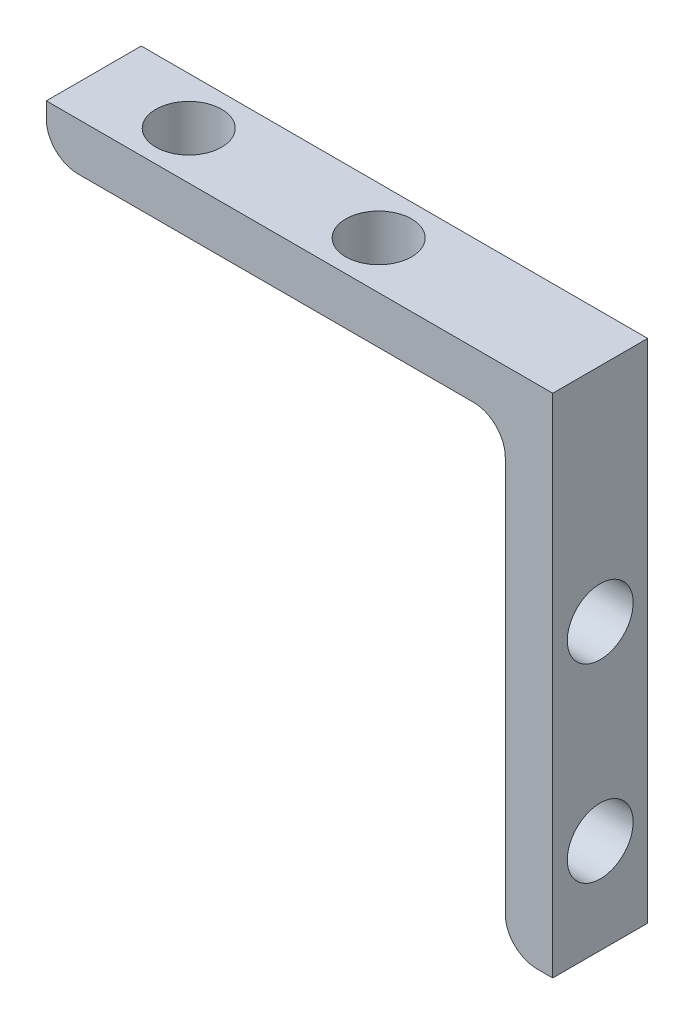
ISO-10303-21;
HEADER;
FILE_DESCRIPTION(('STEP AP214'),'2;1');
FILE_NAME('part.step','',(''),(''),'','','');
FILE_SCHEMA(('AUTOMOTIVE_DESIGN { 1 0 10303 214 1 1 1 1 }'));
ENDSEC;
DATA;
#1=APPLICATION_CONTEXT('core data for automotive mechanical design processes');
#2=APPLICATION_PROTOCOL_DEFINITION('international standard','automotive_design',2000,#1);
#3=PRODUCT_CONTEXT('',#1,'mechanical');
#4=PRODUCT('Part','Part','',(#3));
#5=PRODUCT_RELATED_PRODUCT_CATEGORY('part','',(#4));
#6=PRODUCT_DEFINITION_FORMATION('','',#4);
#7=PRODUCT_DEFINITION_CONTEXT('part definition',#1,'design');
#8=PRODUCT_DEFINITION('design','',#6,#7);
#9=PRODUCT_DEFINITION_SHAPE('','',#8);
#10=(LENGTH_UNIT() NAMED_UNIT(*) SI_UNIT(.MILLI.,.METRE.));
#11=(NAMED_UNIT(*) PLANE_ANGLE_UNIT() SI_UNIT($,.RADIAN.));
#12=(NAMED_UNIT(*) SI_UNIT($,.STERADIAN.) SOLID_ANGLE_UNIT());
#13=UNCERTAINTY_MEASURE_WITH_UNIT(LENGTH_MEASURE(1.E-05),#10,'distance_accuracy_value','');
#14=(GEOMETRIC_REPRESENTATION_CONTEXT(3) GLOBAL_UNCERTAINTY_ASSIGNED_CONTEXT((#13)) GLOBAL_UNIT_ASSIGNED_CONTEXT((#10,
#11,#12)) REPRESENTATION_CONTEXT('',''));
#15=CARTESIAN_POINT('',(0.,0.,0.));
#16=DIRECTION('',(0.,0.,1.));
#17=DIRECTION('',(1.,0.,0.));
#18=AXIS2_PLACEMENT_3D('',#15,#16,#17);
#19=CARTESIAN_POINT('',(-50.8,-4.7625,9.525));
#20=DIRECTION('',(1.,0.,0.));
#21=DIRECTION('',(0.,0.,-1.));
#22=AXIS2_PLACEMENT_3D('',#19,#20,#21);
#23=PLANE('',#22);
#24=DIRECTION('',(0.,-1.,0.));
#25=VECTOR('',#24,1.);
#26=CARTESIAN_POINT('',(-50.8,-4.7625,0.));
#27=LINE('',#26,#25);
#28=CARTESIAN_POINT('',(-50.8,0.,0.));
#29=VERTEX_POINT('',#28);
#30=CARTESIAN_POINT('',(-50.8,-1.5875,0.));
#31=VERTEX_POINT('',#30);
#32=EDGE_CURVE('E137',#29,#31,#27,.T.);
#33=ORIENTED_EDGE('',*,*,#32,.T.);
#34=DIRECTION('',(0.,0.,-1.));
#35=VECTOR('',#34,1.);
#36=CARTESIAN_POINT('',(-50.8,-1.5875,9.525));
#37=LINE('',#36,#35);
#38=CARTESIAN_POINT('',(-50.8,-1.5875,9.525));
#39=VERTEX_POINT('',#38);
#40=EDGE_CURVE('E171',#31,#39,#37,.F.);
#41=ORIENTED_EDGE('',*,*,#40,.T.);
#42=DIRECTION('',(0.,-1.,0.));
#43=VECTOR('',#42,1.);
#44=CARTESIAN_POINT('',(-50.8,-4.7625,9.525));
#45=LINE('',#44,#43);
#46=CARTESIAN_POINT('',(-50.8,0.,9.525));
#47=VERTEX_POINT('',#46);
#48=EDGE_CURVE('E151',#47,#39,#45,.T.);
#49=ORIENTED_EDGE('',*,*,#48,.F.);
#50=DIRECTION('',(0.,0.,-1.));
#51=VECTOR('',#50,1.);
#52=CARTESIAN_POINT('',(-50.8,0.,9.525));
#53=LINE('',#52,#51);
#54=EDGE_CURVE('E133',#47,#29,#53,.T.);
#55=ORIENTED_EDGE('',*,*,#54,.T.);
#56=EDGE_LOOP('',(#33,#41,#49,#55));
#57=FACE_BOUND('',#56,.T.);
#58=ADVANCED_FACE('F34',(#57),#23,.F.);
#59=CARTESIAN_POINT('',(-4.76249999999999,-4.76249999999999,9.525));
#60=DIRECTION('',(0.,1.,0.));
#61=DIRECTION('',(-1.,0.,0.));
#62=AXIS2_PLACEMENT_3D('',#59,#60,#61);
#63=PLANE('',#62);
#64=CARTESIAN_POINT('',(-41.275,-4.7625,4.7625));
#65=DIRECTION('',(0.,-1.,0.));
#66=DIRECTION('',(1.,0.,0.));
#67=AXIS2_PLACEMENT_3D('',#64,#65,#66);
#68=CIRCLE('',#67,3.302);
#69=CARTESIAN_POINT('',(-37.973,-4.7625,4.7625));
#70=VERTEX_POINT('',#69);
#71=EDGE_CURVE('E207',#70,#70,#68,.T.);
#72=ORIENTED_EDGE('',*,*,#71,.F.);
#73=EDGE_LOOP('',(#72));
#74=FACE_BOUND('',#73,.T.);
#75=CARTESIAN_POINT('',(-22.225,-4.76249999999999,4.7625));
#76=DIRECTION('',(0.,-1.,0.));
#77=DIRECTION('',(1.,0.,0.));
#78=AXIS2_PLACEMENT_3D('',#75,#76,#77);
#79=CIRCLE('',#78,3.302);
#80=CARTESIAN_POINT('',(-18.923,-4.76249999999999,4.7625));
#81=VERTEX_POINT('',#80);
#82=EDGE_CURVE('E201',#81,#81,#79,.T.);
#83=ORIENTED_EDGE('',*,*,#82,.F.);
#84=EDGE_LOOP('',(#83));
#85=FACE_BOUND('',#84,.T.);
#86=DIRECTION('',(1.,0.,0.));
#87=VECTOR('',#86,1.);
#88=CARTESIAN_POINT('',(-4.76249999999999,-4.76249999999999,9.525));
#89=LINE('',#88,#87);
#90=CARTESIAN_POINT('',(-47.625,-4.7625,9.525));
#91=VERTEX_POINT('',#90);
#92=CARTESIAN_POINT('',(-7.93749999999999,-4.76249999999999,9.525));
#93=VERTEX_POINT('',#92);
#94=EDGE_CURVE('E182',#91,#93,#89,.T.);
#95=ORIENTED_EDGE('',*,*,#94,.F.);
#96=DIRECTION('',(0.,0.,-1.));
#97=VECTOR('',#96,1.);
#98=CARTESIAN_POINT('',(-47.625,-4.7625,9.525));
#99=LINE('',#98,#97);
#100=CARTESIAN_POINT('',(-47.625,-4.7625,0.));
#101=VERTEX_POINT('',#100);
#102=EDGE_CURVE('E168',#91,#101,#99,.T.);
#103=ORIENTED_EDGE('',*,*,#102,.T.);
#104=DIRECTION('',(1.,0.,0.));
#105=VECTOR('',#104,1.);
#106=CARTESIAN_POINT('',(-4.76249999999999,-4.76249999999999,0.));
#107=LINE('',#106,#105);
#108=CARTESIAN_POINT('',(-7.93749999999999,-4.76249999999999,0.));
#109=VERTEX_POINT('',#108);
#110=EDGE_CURVE('E140',#101,#109,#107,.T.);
#111=ORIENTED_EDGE('',*,*,#110,.T.);
#112=DIRECTION('',(0.,0.,-1.));
#113=VECTOR('',#112,1.);
#114=CARTESIAN_POINT('',(-7.93749999999999,-4.76249999999999,9.525));
#115=LINE('',#114,#113);
#116=EDGE_CURVE('E49',#109,#93,#115,.F.);
#117=ORIENTED_EDGE('',*,*,#116,.T.);
#118=EDGE_LOOP('',(#95,#103,#111,#117));
#119=FACE_BOUND('',#118,.T.);
#120=ADVANCED_FACE('F178',(#74,#85,#119),#63,.F.);
#121=CARTESIAN_POINT('',(-4.76249999999999,-50.8,9.525));
#122=DIRECTION('',(1.,0.,0.));
#123=DIRECTION('',(0.,1.,0.));
#124=AXIS2_PLACEMENT_3D('',#121,#122,#123);
#125=PLANE('',#124);
#126=CARTESIAN_POINT('',(-4.76249999999999,-22.225,4.7625));
#127=DIRECTION('',(-1.,0.,0.));
#128=DIRECTION('',(0.,-1.,0.));
#129=AXIS2_PLACEMENT_3D('',#126,#127,#128);
#130=CIRCLE('',#129,3.302);
#131=CARTESIAN_POINT('',(-4.76249999999999,-25.527,4.7625));
#132=VERTEX_POINT('',#131);
#133=EDGE_CURVE('E196',#132,#132,#130,.T.);
#134=ORIENTED_EDGE('',*,*,#133,.F.);
#135=EDGE_LOOP('',(#134));
#136=FACE_BOUND('',#135,.T.);
#137=CARTESIAN_POINT('',(-4.76249999999999,-41.275,4.7625));
#138=DIRECTION('',(-1.,0.,0.));
#139=DIRECTION('',(0.,-1.,0.));
#140=AXIS2_PLACEMENT_3D('',#137,#138,#139);
#141=CIRCLE('',#140,3.302);
#142=CARTESIAN_POINT('',(-4.76249999999999,-44.577,4.7625));
#143=VERTEX_POINT('',#142);
#144=EDGE_CURVE('E189',#143,#143,#141,.T.);
#145=ORIENTED_EDGE('',*,*,#144,.F.);
#146=EDGE_LOOP('',(#145));
#147=FACE_BOUND('',#146,.T.);
#148=DIRECTION('',(0.,-1.,0.));
#149=VECTOR('',#148,1.);
#150=CARTESIAN_POINT('',(-4.76249999999999,-50.8,0.));
#151=LINE('',#150,#149);
#152=CARTESIAN_POINT('',(-4.76249999999999,-7.9375,0.));
#153=VERTEX_POINT('',#152);
#154=CARTESIAN_POINT('',(-4.76249999999999,-47.625,0.));
#155=VERTEX_POINT('',#154);
#156=EDGE_CURVE('E143',#153,#155,#151,.T.);
#157=ORIENTED_EDGE('',*,*,#156,.T.);
#158=DIRECTION('',(0.,0.,-1.));
#159=VECTOR('',#158,1.);
#160=CARTESIAN_POINT('',(-4.76249999999999,-47.625,9.525));
#161=LINE('',#160,#159);
#162=CARTESIAN_POINT('',(-4.76249999999999,-47.625,9.525));
#163=VERTEX_POINT('',#162);
#164=EDGE_CURVE('E163',#155,#163,#161,.F.);
#165=ORIENTED_EDGE('',*,*,#164,.T.);
#166=DIRECTION('',(0.,-1.,0.));
#167=VECTOR('',#166,1.);
#168=CARTESIAN_POINT('',(-4.76249999999999,-50.8,9.525));
#169=LINE('',#168,#167);
#170=CARTESIAN_POINT('',(-4.76249999999999,-7.9375,9.525));
#171=VERTEX_POINT('',#170);
#172=EDGE_CURVE('E116',#171,#163,#169,.T.);
#173=ORIENTED_EDGE('',*,*,#172,.F.);
#174=DIRECTION('',(0.,0.,-1.));
#175=VECTOR('',#174,1.);
#176=CARTESIAN_POINT('',(-4.76249999999999,-7.93749999999999,0.));
#177=LINE('',#176,#175);
#178=EDGE_CURVE('E160',#171,#153,#177,.T.);
#179=ORIENTED_EDGE('',*,*,#178,.T.);
#180=EDGE_LOOP('',(#157,#165,#173,#179));
#181=FACE_BOUND('',#180,.T.);
#182=ADVANCED_FACE('F184',(#136,#147,#181),#125,.F.);
#183=CARTESIAN_POINT('',(0.,-50.8,9.525));
#184=DIRECTION('',(0.,1.,0.));
#185=DIRECTION('',(0.,0.,1.));
#186=AXIS2_PLACEMENT_3D('',#183,#184,#185);
#187=PLANE('',#186);
#188=DIRECTION('',(1.,0.,0.));
#189=VECTOR('',#188,1.);
#190=CARTESIAN_POINT('',(0.,-50.8,9.525));
#191=LINE('',#190,#189);
#192=CARTESIAN_POINT('',(-1.58749999999999,-50.8,9.525));
#193=VERTEX_POINT('',#192);
#194=CARTESIAN_POINT('',(0.,-50.8,9.525));
#195=VERTEX_POINT('',#194);
#196=EDGE_CURVE('E104',#193,#195,#191,.T.);
#197=ORIENTED_EDGE('',*,*,#196,.F.);
#198=DIRECTION('',(0.,0.,-1.));
#199=VECTOR('',#198,1.);
#200=CARTESIAN_POINT('',(-1.58749999999999,-50.8,9.525));
#201=LINE('',#200,#199);
#202=CARTESIAN_POINT('',(-1.58749999999999,-50.8,0.));
#203=VERTEX_POINT('',#202);
#204=EDGE_CURVE('E125',#193,#203,#201,.T.);
#205=ORIENTED_EDGE('',*,*,#204,.T.);
#206=DIRECTION('',(1.,0.,0.));
#207=VECTOR('',#206,1.);
#208=CARTESIAN_POINT('',(0.,-50.8,0.));
#209=LINE('',#208,#207);
#210=CARTESIAN_POINT('',(0.,-50.8,0.));
#211=VERTEX_POINT('',#210);
#212=EDGE_CURVE('E122',#203,#211,#209,.T.);
#213=ORIENTED_EDGE('',*,*,#212,.T.);
#214=DIRECTION('',(0.,0.,-1.));
#215=VECTOR('',#214,1.);
#216=CARTESIAN_POINT('',(0.,-50.8,9.525));
#217=LINE('',#216,#215);
#218=EDGE_CURVE('E119',#195,#211,#217,.T.);
#219=ORIENTED_EDGE('',*,*,#218,.F.);
#220=EDGE_LOOP('',(#197,#205,#213,#219));
#221=FACE_BOUND('',#220,.T.);
#222=ADVANCED_FACE('F120',(#221),#187,.F.);
#223=CARTESIAN_POINT('',(0.,0.,9.525));
#224=DIRECTION('',(-1.,0.,0.));
#225=DIRECTION('',(0.,-1.,0.));
#226=AXIS2_PLACEMENT_3D('',#223,#224,#225);
#227=PLANE('',#226);
#228=CARTESIAN_POINT('',(0.,-22.225,4.7625));
#229=DIRECTION('',(-1.,0.,0.));
#230=DIRECTION('',(0.,-1.,0.));
#231=AXIS2_PLACEMENT_3D('',#228,#229,#230);
#232=CIRCLE('',#231,3.302);
#233=CARTESIAN_POINT('',(0.,-25.527,4.7625));
#234=VERTEX_POINT('',#233);
#235=EDGE_CURVE('E141',#234,#234,#232,.T.);
#236=ORIENTED_EDGE('',*,*,#235,.T.);
#237=EDGE_LOOP('',(#236));
#238=FACE_BOUND('',#237,.T.);
#239=CARTESIAN_POINT('',(0.,-41.275,4.7625));
#240=DIRECTION('',(-1.,0.,0.));
#241=DIRECTION('',(0.,-1.,0.));
#242=AXIS2_PLACEMENT_3D('',#239,#240,#241);
#243=CIRCLE('',#242,3.302);
#244=CARTESIAN_POINT('',(0.,-44.577,4.7625));
#245=VERTEX_POINT('',#244);
#246=EDGE_CURVE('E192',#245,#245,#243,.T.);
#247=ORIENTED_EDGE('',*,*,#246,.T.);
#248=EDGE_LOOP('',(#247));
#249=FACE_BOUND('',#248,.T.);
#250=DIRECTION('',(0.,1.,0.));
#251=VECTOR('',#250,1.);
#252=CARTESIAN_POINT('',(0.,0.,0.));
#253=LINE('',#252,#251);
#254=CARTESIAN_POINT('',(0.,0.,0.));
#255=VERTEX_POINT('',#254);
#256=EDGE_CURVE('E147',#211,#255,#253,.T.);
#257=ORIENTED_EDGE('',*,*,#256,.T.);
#258=DIRECTION('',(0.,0.,-1.));
#259=VECTOR('',#258,1.);
#260=CARTESIAN_POINT('',(0.,0.,9.525));
#261=LINE('',#260,#259);
#262=CARTESIAN_POINT('',(0.,0.,9.525));
#263=VERTEX_POINT('',#262);
#264=EDGE_CURVE('E126',#263,#255,#261,.T.);
#265=ORIENTED_EDGE('',*,*,#264,.F.);
#266=DIRECTION('',(0.,1.,0.));
#267=VECTOR('',#266,1.);
#268=CARTESIAN_POINT('',(0.,0.,9.525));
#269=LINE('',#268,#267);
#270=EDGE_CURVE('E109',#195,#263,#269,.T.);
#271=ORIENTED_EDGE('',*,*,#270,.F.);
#272=ORIENTED_EDGE('',*,*,#218,.T.);
#273=EDGE_LOOP('',(#257,#265,#271,#272));
#274=FACE_BOUND('',#273,.T.);
#275=ADVANCED_FACE('F128',(#238,#249,#274),#227,.F.);
#276=CARTESIAN_POINT('',(-50.8,0.,9.525));
#277=DIRECTION('',(0.,-1.,0.));
#278=DIRECTION('',(0.,0.,-1.));
#279=AXIS2_PLACEMENT_3D('',#276,#277,#278);
#280=PLANE('',#279);
#281=CARTESIAN_POINT('',(-41.275,0.,4.7625));
#282=DIRECTION('',(0.,-1.,0.));
#283=DIRECTION('',(1.,0.,0.));
#284=AXIS2_PLACEMENT_3D('',#281,#282,#283);
#285=CIRCLE('',#284,3.302);
#286=CARTESIAN_POINT('',(-37.973,0.,4.7625));
#287=VERTEX_POINT('',#286);
#288=EDGE_CURVE('E193',#287,#287,#285,.T.);
#289=ORIENTED_EDGE('',*,*,#288,.T.);
#290=EDGE_LOOP('',(#289));
#291=FACE_BOUND('',#290,.T.);
#292=CARTESIAN_POINT('',(-22.225,0.,4.7625));
#293=DIRECTION('',(0.,-1.,0.));
#294=DIRECTION('',(1.,0.,0.));
#295=AXIS2_PLACEMENT_3D('',#292,#293,#294);
#296=CIRCLE('',#295,3.302);
#297=CARTESIAN_POINT('',(-18.923,0.,4.7625));
#298=VERTEX_POINT('',#297);
#299=EDGE_CURVE('E204',#298,#298,#296,.T.);
#300=ORIENTED_EDGE('',*,*,#299,.T.);
#301=EDGE_LOOP('',(#300));
#302=FACE_BOUND('',#301,.T.);
#303=DIRECTION('',(-1.,0.,0.));
#304=VECTOR('',#303,1.);
#305=CARTESIAN_POINT('',(-50.8,0.,0.));
#306=LINE('',#305,#304);
#307=EDGE_CURVE('E149',#255,#29,#306,.T.);
#308=ORIENTED_EDGE('',*,*,#307,.T.);
#309=ORIENTED_EDGE('',*,*,#54,.F.);
#310=DIRECTION('',(-1.,0.,0.));
#311=VECTOR('',#310,1.);
#312=CARTESIAN_POINT('',(-50.8,0.,9.525));
#313=LINE('',#312,#311);
#314=EDGE_CURVE('E131',#263,#47,#313,.T.);
#315=ORIENTED_EDGE('',*,*,#314,.F.);
#316=ORIENTED_EDGE('',*,*,#264,.T.);
#317=EDGE_LOOP('',(#308,#309,#315,#316));
#318=FACE_BOUND('',#317,.T.);
#319=ADVANCED_FACE('F213',(#291,#302,#318),#280,.F.);
#320=CARTESIAN_POINT('',(0.,0.,9.525));
#321=DIRECTION('',(0.,0.,-1.));
#322=DIRECTION('',(-1.,0.,0.));
#323=AXIS2_PLACEMENT_3D('',#320,#321,#322);
#324=PLANE('',#323);
#325=ORIENTED_EDGE('',*,*,#172,.T.);
#326=CARTESIAN_POINT('',(-1.58749999999999,-47.625,9.525));
#327=DIRECTION('',(0.,0.,-1.));
#328=DIRECTION('',(-1.,0.,0.));
#329=AXIS2_PLACEMENT_3D('',#326,#327,#328);
#330=CIRCLE('',#329,3.175);
#331=EDGE_CURVE('E112',#163,#193,#330,.F.);
#332=ORIENTED_EDGE('',*,*,#331,.T.);
#333=ORIENTED_EDGE('',*,*,#196,.T.);
#334=ORIENTED_EDGE('',*,*,#270,.T.);
#335=ORIENTED_EDGE('',*,*,#314,.T.);
#336=ORIENTED_EDGE('',*,*,#48,.T.);
#337=CARTESIAN_POINT('',(-47.625,-1.5875,9.525));
#338=DIRECTION('',(0.,0.,-1.));
#339=DIRECTION('',(-1.,0.,0.));
#340=AXIS2_PLACEMENT_3D('',#337,#338,#339);
#341=CIRCLE('',#340,3.175);
#342=EDGE_CURVE('E56',#39,#91,#341,.F.);
#343=ORIENTED_EDGE('',*,*,#342,.T.);
#344=ORIENTED_EDGE('',*,*,#94,.T.);
#345=CARTESIAN_POINT('',(-7.93749999999999,-7.93749999999999,9.525));
#346=DIRECTION('',(0.,0.,-1.));
#347=DIRECTION('',(-1.,0.,0.));
#348=AXIS2_PLACEMENT_3D('',#345,#346,#347);
#349=CIRCLE('',#348,3.175);
#350=EDGE_CURVE('E12',#93,#171,#349,.T.);
#351=ORIENTED_EDGE('',*,*,#350,.T.);
#352=EDGE_LOOP('',(#325,#332,#333,#334,#335,#336,#343,#344,#351));
#353=FACE_BOUND('',#352,.T.);
#354=ADVANCED_FACE('F107',(#353),#324,.F.);
#355=CARTESIAN_POINT('',(0.,0.,0.));
#356=DIRECTION('',(0.,0.,-1.));
#357=DIRECTION('',(-1.,0.,0.));
#358=AXIS2_PLACEMENT_3D('',#355,#356,#357);
#359=PLANE('',#358);
#360=ORIENTED_EDGE('',*,*,#212,.F.);
#361=CARTESIAN_POINT('',(-1.58749999999999,-47.625,0.));
#362=DIRECTION('',(0.,0.,-1.));
#363=DIRECTION('',(-1.,0.,0.));
#364=AXIS2_PLACEMENT_3D('',#361,#362,#363);
#365=CIRCLE('',#364,3.175);
#366=EDGE_CURVE('E158',#203,#155,#365,.T.);
#367=ORIENTED_EDGE('',*,*,#366,.T.);
#368=ORIENTED_EDGE('',*,*,#156,.F.);
#369=CARTESIAN_POINT('',(-7.93749999999999,-7.93749999999999,0.));
#370=DIRECTION('',(0.,0.,-1.));
#371=DIRECTION('',(-1.,0.,0.));
#372=AXIS2_PLACEMENT_3D('',#369,#370,#371);
#373=CIRCLE('',#372,3.175);
#374=EDGE_CURVE('E42',#153,#109,#373,.F.);
#375=ORIENTED_EDGE('',*,*,#374,.T.);
#376=ORIENTED_EDGE('',*,*,#110,.F.);
#377=CARTESIAN_POINT('',(-47.625,-1.5875,0.));
#378=DIRECTION('',(0.,0.,-1.));
#379=DIRECTION('',(-1.,0.,0.));
#380=AXIS2_PLACEMENT_3D('',#377,#378,#379);
#381=CIRCLE('',#380,3.175);
#382=EDGE_CURVE('E156',#101,#31,#381,.T.);
#383=ORIENTED_EDGE('',*,*,#382,.T.);
#384=ORIENTED_EDGE('',*,*,#32,.F.);
#385=ORIENTED_EDGE('',*,*,#307,.F.);
#386=ORIENTED_EDGE('',*,*,#256,.F.);
#387=EDGE_LOOP('',(#360,#367,#368,#375,#376,#383,#384,#385,#386));
#388=FACE_BOUND('',#387,.T.);
#389=ADVANCED_FACE('F175',(#388),#359,.T.);
#390=CARTESIAN_POINT('',(-1.58749999999999,-47.625,9.525));
#391=DIRECTION('',(0.,0.,-1.));
#392=DIRECTION('',(-1.,0.,0.));
#393=AXIS2_PLACEMENT_3D('',#390,#391,#392);
#394=CYLINDRICAL_SURFACE('',#393,3.175);
#395=ORIENTED_EDGE('',*,*,#331,.F.);
#396=ORIENTED_EDGE('',*,*,#164,.F.);
#397=ORIENTED_EDGE('',*,*,#366,.F.);
#398=ORIENTED_EDGE('',*,*,#204,.F.);
#399=EDGE_LOOP('',(#395,#396,#397,#398));
#400=FACE_BOUND('',#399,.T.);
#401=ADVANCED_FACE('F246',(#400),#394,.T.);
#402=CARTESIAN_POINT('',(-47.625,-1.5875,9.525));
#403=DIRECTION('',(0.,0.,-1.));
#404=DIRECTION('',(-1.,0.,0.));
#405=AXIS2_PLACEMENT_3D('',#402,#403,#404);
#406=CYLINDRICAL_SURFACE('',#405,3.175);
#407=ORIENTED_EDGE('',*,*,#342,.F.);
#408=ORIENTED_EDGE('',*,*,#40,.F.);
#409=ORIENTED_EDGE('',*,*,#382,.F.);
#410=ORIENTED_EDGE('',*,*,#102,.F.);
#411=EDGE_LOOP('',(#407,#408,#409,#410));
#412=FACE_BOUND('',#411,.T.);
#413=ADVANCED_FACE('F248',(#412),#406,.T.);
#414=CARTESIAN_POINT('',(-7.93749999999999,-7.93749999999999,9.525));
#415=DIRECTION('',(0.,0.,1.));
#416=DIRECTION('',(1.,0.,0.));
#417=AXIS2_PLACEMENT_3D('',#414,#415,#416);
#418=CYLINDRICAL_SURFACE('',#417,3.175);
#419=ORIENTED_EDGE('',*,*,#350,.F.);
#420=ORIENTED_EDGE('',*,*,#116,.F.);
#421=ORIENTED_EDGE('',*,*,#374,.F.);
#422=ORIENTED_EDGE('',*,*,#178,.F.);
#423=EDGE_LOOP('',(#419,#420,#421,#422));
#424=FACE_BOUND('',#423,.T.);
#425=ADVANCED_FACE('F36',(#424),#418,.F.);
#426=CARTESIAN_POINT('',(0.,-41.275,4.7625));
#427=DIRECTION('',(-1.,0.,0.));
#428=DIRECTION('',(0.,-1.,0.));
#429=AXIS2_PLACEMENT_3D('',#426,#427,#428);
#430=CYLINDRICAL_SURFACE('',#429,3.302);
#431=CARTESIAN_POINT('',(0.,-44.577,4.7625));
#432=CARTESIAN_POINT('',(-0.0496093749999942,-44.577,4.7625));
#433=CARTESIAN_POINT('',(-0.0992187499999942,-44.577,4.7625));
#434=CARTESIAN_POINT('',(-0.198437499999994,-44.577,4.7625));
#435=CARTESIAN_POINT('',(-0.248046874999994,-44.577,4.7625));
#436=CARTESIAN_POINT('',(-0.347265624999994,-44.577,4.7625));
#437=CARTESIAN_POINT('',(-0.396874999999994,-44.577,4.7625));
#438=CARTESIAN_POINT('',(-0.496093749999994,-44.577,4.7625));
#439=CARTESIAN_POINT('',(-0.545703124999994,-44.577,4.7625));
#440=CARTESIAN_POINT('',(-0.644921874999994,-44.577,4.7625));
#441=CARTESIAN_POINT('',(-0.694531249999994,-44.577,4.7625));
#442=CARTESIAN_POINT('',(-0.793749999999994,-44.577,4.7625));
#443=CARTESIAN_POINT('',(-0.843359374999994,-44.577,4.7625));
#444=CARTESIAN_POINT('',(-0.942578124999994,-44.577,4.7625));
#445=CARTESIAN_POINT('',(-0.992187499999994,-44.577,4.7625));
#446=CARTESIAN_POINT('',(-1.09140624999999,-44.577,4.7625));
#447=CARTESIAN_POINT('',(-1.14101562499999,-44.577,4.7625));
#448=CARTESIAN_POINT('',(-1.24023437499999,-44.577,4.7625));
#449=CARTESIAN_POINT('',(-1.28984374999999,-44.577,4.7625));
#450=CARTESIAN_POINT('',(-1.38906249999999,-44.577,4.7625));
#451=CARTESIAN_POINT('',(-1.43867187499999,-44.577,4.7625));
#452=CARTESIAN_POINT('',(-1.53789062499999,-44.577,4.7625));
#453=CARTESIAN_POINT('',(-1.58749999999999,-44.577,4.7625));
#454=CARTESIAN_POINT('',(-1.68671874999999,-44.577,4.7625));
#455=CARTESIAN_POINT('',(-1.73632812499999,-44.577,4.7625));
#456=CARTESIAN_POINT('',(-1.83554687499999,-44.577,4.7625));
#457=CARTESIAN_POINT('',(-1.88515624999999,-44.577,4.7625));
#458=CARTESIAN_POINT('',(-1.98437499999999,-44.577,4.7625));
#459=CARTESIAN_POINT('',(-2.03398437499999,-44.577,4.7625));
#460=CARTESIAN_POINT('',(-2.13320312499999,-44.577,4.7625));
#461=CARTESIAN_POINT('',(-2.18281249999999,-44.577,4.7625));
#462=CARTESIAN_POINT('',(-2.28203124999999,-44.577,4.7625));
#463=CARTESIAN_POINT('',(-2.33164062499999,-44.577,4.7625));
#464=CARTESIAN_POINT('',(-2.43085937499999,-44.577,4.7625));
#465=CARTESIAN_POINT('',(-2.48046874999999,-44.577,4.7625));
#466=CARTESIAN_POINT('',(-2.57968749999999,-44.577,4.7625));
#467=CARTESIAN_POINT('',(-2.62929687499999,-44.577,4.7625));
#468=CARTESIAN_POINT('',(-2.72851562499999,-44.577,4.7625));
#469=CARTESIAN_POINT('',(-2.77812499999999,-44.577,4.7625));
#470=CARTESIAN_POINT('',(-2.87734374999999,-44.577,4.7625));
#471=CARTESIAN_POINT('',(-2.92695312499999,-44.577,4.7625));
#472=CARTESIAN_POINT('',(-3.02617187499999,-44.577,4.7625));
#473=CARTESIAN_POINT('',(-3.07578124999999,-44.577,4.7625));
#474=CARTESIAN_POINT('',(-3.17499999999999,-44.577,4.7625));
#475=CARTESIAN_POINT('',(-3.22460937499999,-44.577,4.7625));
#476=CARTESIAN_POINT('',(-3.32382812499999,-44.577,4.7625));
#477=CARTESIAN_POINT('',(-3.37343749999999,-44.577,4.7625));
#478=CARTESIAN_POINT('',(-3.47265624999999,-44.577,4.7625));
#479=CARTESIAN_POINT('',(-3.52226562499999,-44.577,4.7625));
#480=CARTESIAN_POINT('',(-3.62148437499999,-44.577,4.7625));
#481=CARTESIAN_POINT('',(-3.67109374999999,-44.577,4.7625));
#482=CARTESIAN_POINT('',(-3.77031249999999,-44.577,4.7625));
#483=CARTESIAN_POINT('',(-3.81992187499999,-44.577,4.7625));
#484=CARTESIAN_POINT('',(-3.91914062499999,-44.577,4.7625));
#485=CARTESIAN_POINT('',(-3.96874999999999,-44.577,4.7625));
#486=CARTESIAN_POINT('',(-4.06796874999999,-44.577,4.7625));
#487=CARTESIAN_POINT('',(-4.11757812499999,-44.577,4.7625));
#488=CARTESIAN_POINT('',(-4.21679687499999,-44.577,4.7625));
#489=CARTESIAN_POINT('',(-4.26640624999999,-44.577,4.7625));
#490=CARTESIAN_POINT('',(-4.36562499999999,-44.577,4.7625));
#491=CARTESIAN_POINT('',(-4.41523437499999,-44.577,4.7625));
#492=CARTESIAN_POINT('',(-4.51445312499999,-44.577,4.7625));
#493=CARTESIAN_POINT('',(-4.56406249999999,-44.577,4.7625));
#494=CARTESIAN_POINT('',(-4.66328124999999,-44.577,4.7625));
#495=CARTESIAN_POINT('',(-4.71289062499999,-44.577,4.7625));
#496=CARTESIAN_POINT('',(-4.76249999999999,-44.577,4.7625));
#497=B_SPLINE_CURVE_WITH_KNOTS('',3,(#431,#432,#433,#434,#435,#436,#437,#438,#439,#440,#441,
#442,#443,#444,#445,#446,#447,#448,#449,#450,#451,#452,#453,#454,#455,#456,#457,#458,#459,#460,
#461,#462,#463,#464,#465,#466,#467,#468,#469,#470,#471,#472,#473,#474,#475,#476,#477,#478,#479,
#480,#481,#482,#483,#484,#485,#486,#487,#488,#489,#490,#491,#492,#493,#494,#495,#496),
.UNSPECIFIED.,.F.,.F.,(4,2,2,2,2,2,2,2,2,2,2,2,2,2,2,2,2,2,2,2,2,2,2,2,2,2,2,2,2,2,2,2,4),(0.,
0.148828125,0.29765625,0.446484375,0.5953125,0.744140625,0.89296875,1.041796875,1.190625,
1.339453125,1.48828125,1.637109375,1.7859375,1.934765625,2.08359375,2.232421875,2.38125,
2.530078125,2.67890625,2.827734375,2.9765625,3.125390625,3.27421875,3.423046875,3.571875,
3.720703125,3.86953125,4.018359375,4.1671875,4.316015625,4.46484375,4.613671875,4.7625),.UNSPECIFIED.);
#498=EDGE_CURVE('BSEAM235',#245,#143,#497,.T.);
#499=ORIENTED_EDGE('',*,*,#246,.F.);
#500=ORIENTED_EDGE('',*,*,#144,.T.);
#501=ORIENTED_EDGE('',*,*,#498,.T.);
#502=ORIENTED_EDGE('',*,*,#498,.F.);
#503=EDGE_LOOP('',(#499,#501,#500,#502));
#504=FACE_BOUND('',#503,.T.);
#505=ADVANCED_FACE('F235',(#504),#430,.F.);
#506=CARTESIAN_POINT('',(0.,-22.225,4.7625));
#507=DIRECTION('',(-1.,0.,0.));
#508=DIRECTION('',(0.,-1.,0.));
#509=AXIS2_PLACEMENT_3D('',#506,#507,#508);
#510=CYLINDRICAL_SURFACE('',#509,3.302);
#511=CARTESIAN_POINT('',(0.,-25.527,4.7625));
#512=CARTESIAN_POINT('',(-0.0496093749999924,-25.527,4.7625));
#513=CARTESIAN_POINT('',(-0.0992187499999924,-25.527,4.7625));
#514=CARTESIAN_POINT('',(-0.198437499999992,-25.527,4.7625));
#515=CARTESIAN_POINT('',(-0.248046874999992,-25.527,4.7625));
#516=CARTESIAN_POINT('',(-0.347265624999992,-25.527,4.7625));
#517=CARTESIAN_POINT('',(-0.396874999999992,-25.527,4.7625));
#518=CARTESIAN_POINT('',(-0.496093749999993,-25.527,4.7625));
#519=CARTESIAN_POINT('',(-0.545703124999993,-25.527,4.7625));
#520=CARTESIAN_POINT('',(-0.644921874999993,-25.527,4.7625));
#521=CARTESIAN_POINT('',(-0.694531249999992,-25.527,4.7625));
#522=CARTESIAN_POINT('',(-0.793749999999993,-25.527,4.7625));
#523=CARTESIAN_POINT('',(-0.843359374999993,-25.527,4.7625));
#524=CARTESIAN_POINT('',(-0.942578124999992,-25.527,4.7625));
#525=CARTESIAN_POINT('',(-0.992187499999992,-25.527,4.7625));
#526=CARTESIAN_POINT('',(-1.09140624999999,-25.527,4.7625));
#527=CARTESIAN_POINT('',(-1.14101562499999,-25.527,4.7625));
#528=CARTESIAN_POINT('',(-1.24023437499999,-25.527,4.7625));
#529=CARTESIAN_POINT('',(-1.28984374999999,-25.527,4.7625));
#530=CARTESIAN_POINT('',(-1.38906249999999,-25.527,4.7625));
#531=CARTESIAN_POINT('',(-1.43867187499999,-25.527,4.7625));
#532=CARTESIAN_POINT('',(-1.53789062499999,-25.527,4.7625));
#533=CARTESIAN_POINT('',(-1.58749999999999,-25.527,4.7625));
#534=CARTESIAN_POINT('',(-1.68671874999999,-25.527,4.7625));
#535=CARTESIAN_POINT('',(-1.73632812499999,-25.527,4.7625));
#536=CARTESIAN_POINT('',(-1.83554687499999,-25.527,4.7625));
#537=CARTESIAN_POINT('',(-1.88515624999999,-25.527,4.7625));
#538=CARTESIAN_POINT('',(-1.98437499999999,-25.527,4.7625));
#539=CARTESIAN_POINT('',(-2.03398437499999,-25.527,4.7625));
#540=CARTESIAN_POINT('',(-2.13320312499999,-25.527,4.7625));
#541=CARTESIAN_POINT('',(-2.18281249999999,-25.527,4.7625));
#542=CARTESIAN_POINT('',(-2.28203124999999,-25.527,4.7625));
#543=CARTESIAN_POINT('',(-2.33164062499999,-25.527,4.7625));
#544=CARTESIAN_POINT('',(-2.43085937499999,-25.527,4.7625));
#545=CARTESIAN_POINT('',(-2.48046874999999,-25.527,4.7625));
#546=CARTESIAN_POINT('',(-2.57968749999999,-25.527,4.7625));
#547=CARTESIAN_POINT('',(-2.62929687499999,-25.527,4.7625));
#548=CARTESIAN_POINT('',(-2.72851562499999,-25.527,4.7625));
#549=CARTESIAN_POINT('',(-2.77812499999999,-25.527,4.7625));
#550=CARTESIAN_POINT('',(-2.87734374999999,-25.527,4.7625));
#551=CARTESIAN_POINT('',(-2.92695312499999,-25.527,4.7625));
#552=CARTESIAN_POINT('',(-3.02617187499999,-25.527,4.7625));
#553=CARTESIAN_POINT('',(-3.07578124999999,-25.527,4.7625));
#554=CARTESIAN_POINT('',(-3.17499999999999,-25.527,4.7625));
#555=CARTESIAN_POINT('',(-3.22460937499999,-25.527,4.7625));
#556=CARTESIAN_POINT('',(-3.32382812499999,-25.527,4.7625));
#557=CARTESIAN_POINT('',(-3.37343749999999,-25.527,4.7625));
#558=CARTESIAN_POINT('',(-3.47265624999999,-25.527,4.7625));
#559=CARTESIAN_POINT('',(-3.52226562499999,-25.527,4.7625));
#560=CARTESIAN_POINT('',(-3.62148437499999,-25.527,4.7625));
#561=CARTESIAN_POINT('',(-3.67109374999999,-25.527,4.7625));
#562=CARTESIAN_POINT('',(-3.77031249999999,-25.527,4.7625));
#563=CARTESIAN_POINT('',(-3.81992187499999,-25.527,4.7625));
#564=CARTESIAN_POINT('',(-3.91914062499999,-25.527,4.7625));
#565=CARTESIAN_POINT('',(-3.96874999999999,-25.527,4.7625));
#566=CARTESIAN_POINT('',(-4.06796874999999,-25.527,4.7625));
#567=CARTESIAN_POINT('',(-4.11757812499999,-25.527,4.7625));
#568=CARTESIAN_POINT('',(-4.21679687499999,-25.527,4.7625));
#569=CARTESIAN_POINT('',(-4.26640624999999,-25.527,4.7625));
#570=CARTESIAN_POINT('',(-4.36562499999999,-25.527,4.7625));
#571=CARTESIAN_POINT('',(-4.41523437499999,-25.527,4.7625));
#572=CARTESIAN_POINT('',(-4.51445312499999,-25.527,4.7625));
#573=CARTESIAN_POINT('',(-4.56406249999999,-25.527,4.7625));
#574=CARTESIAN_POINT('',(-4.66328124999999,-25.527,4.7625));
#575=CARTESIAN_POINT('',(-4.71289062499999,-25.527,4.7625));
#576=CARTESIAN_POINT('',(-4.76249999999999,-25.527,4.7625));
#577=B_SPLINE_CURVE_WITH_KNOTS('',3,(#511,#512,#513,#514,#515,#516,#517,#518,#519,#520,#521,
#522,#523,#524,#525,#526,#527,#528,#529,#530,#531,#532,#533,#534,#535,#536,#537,#538,#539,#540,
#541,#542,#543,#544,#545,#546,#547,#548,#549,#550,#551,#552,#553,#554,#555,#556,#557,#558,#559,
#560,#561,#562,#563,#564,#565,#566,#567,#568,#569,#570,#571,#572,#573,#574,#575,#576),
.UNSPECIFIED.,.F.,.F.,(4,2,2,2,2,2,2,2,2,2,2,2,2,2,2,2,2,2,2,2,2,2,2,2,2,2,2,2,2,2,2,2,4),(0.,
0.148828125,0.29765625,0.446484375,0.5953125,0.744140625,0.89296875,1.041796875,1.190625,
1.339453125,1.48828125,1.637109375,1.7859375,1.934765625,2.08359375,2.232421875,2.38125,
2.530078125,2.67890625,2.827734375,2.9765625,3.125390625,3.27421875,3.423046875,3.571875,
3.720703125,3.86953125,4.018359375,4.1671875,4.316015625,4.46484375,4.613671875,4.7625),.UNSPECIFIED.);
#578=EDGE_CURVE('BSEAM229',#234,#132,#577,.T.);
#579=ORIENTED_EDGE('',*,*,#235,.F.);
#580=ORIENTED_EDGE('',*,*,#133,.T.);
#581=ORIENTED_EDGE('',*,*,#578,.T.);
#582=ORIENTED_EDGE('',*,*,#578,.F.);
#583=EDGE_LOOP('',(#579,#581,#580,#582));
#584=FACE_BOUND('',#583,.T.);
#585=ADVANCED_FACE('F229',(#584),#510,.F.);
#586=CARTESIAN_POINT('',(-22.225,0.,4.7625));
#587=DIRECTION('',(0.,-1.,0.));
#588=DIRECTION('',(1.,0.,0.));
#589=AXIS2_PLACEMENT_3D('',#586,#587,#588);
#590=CYLINDRICAL_SURFACE('',#589,3.302);
#591=ORIENTED_EDGE('',*,*,#299,.F.);
#592=EDGE_LOOP('',(#591));
#593=FACE_BOUND('',#592,.T.);
#594=ORIENTED_EDGE('',*,*,#82,.T.);
#595=EDGE_LOOP('',(#594));
#596=FACE_BOUND('',#595,.T.);
#597=ADVANCED_FACE('F219',(#593,#596),#590,.F.);
#598=CARTESIAN_POINT('',(-41.275,0.,4.7625));
#599=DIRECTION('',(0.,-1.,0.));
#600=DIRECTION('',(1.,0.,0.));
#601=AXIS2_PLACEMENT_3D('',#598,#599,#600);
#602=CYLINDRICAL_SURFACE('',#601,3.302);
#603=ORIENTED_EDGE('',*,*,#288,.F.);
#604=EDGE_LOOP('',(#603));
#605=FACE_BOUND('',#604,.T.);
#606=ORIENTED_EDGE('',*,*,#71,.T.);
#607=EDGE_LOOP('',(#606));
#608=FACE_BOUND('',#607,.T.);
#609=ADVANCED_FACE('F216',(#605,#608),#602,.F.);
#610=CLOSED_SHELL('',(#58,#120,#182,#222,#275,#319,#354,#389,#401,#413,#425,#505,#585,#597,#609));
#611=MANIFOLD_SOLID_BREP('B2',#610);
#612=ADVANCED_BREP_SHAPE_REPRESENTATION('',(#18,#611),#14);
#613=SHAPE_DEFINITION_REPRESENTATION(#9,#612);
ENDSEC;
END-ISO-10303-21;
